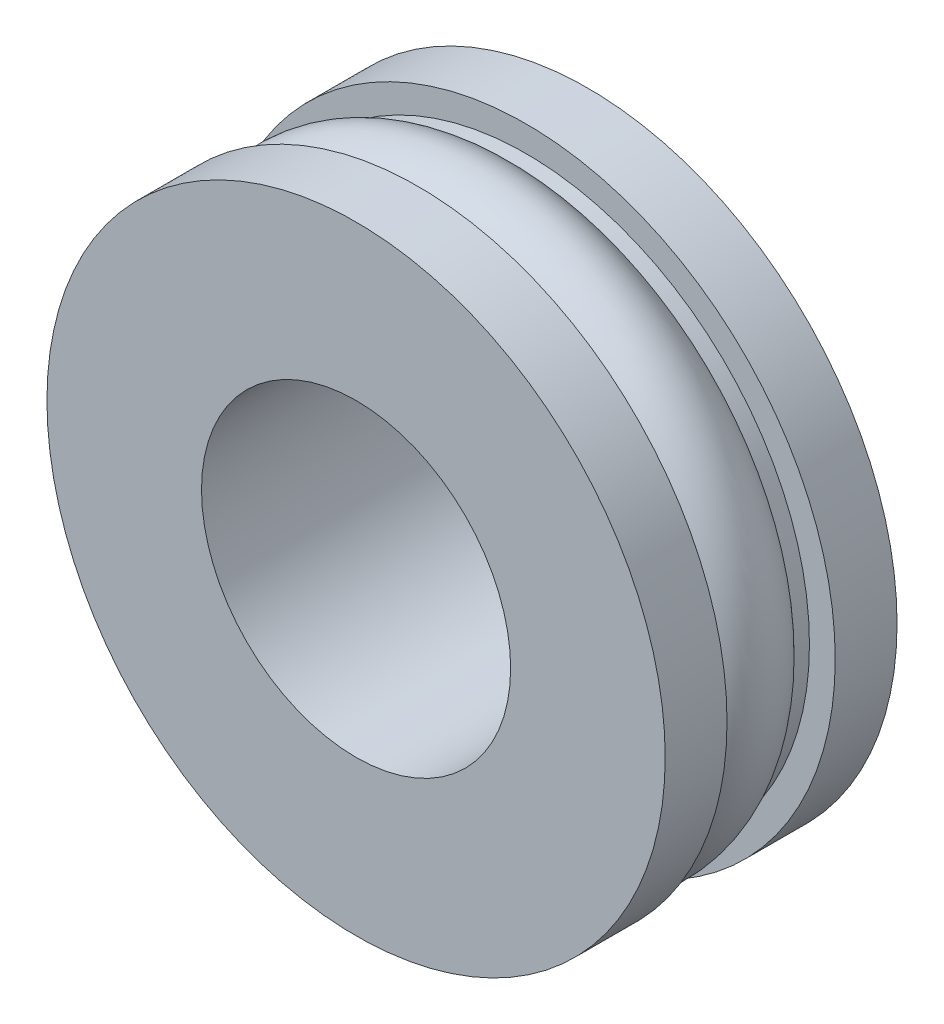
ISO-10303-21;
HEADER;
FILE_DESCRIPTION(('STEP AP214'),'2;1');
FILE_NAME('part.step','',(''),(''),'','','');
FILE_SCHEMA(('AUTOMOTIVE_DESIGN { 1 0 10303 214 1 1 1 1 }'));
ENDSEC;
DATA;
#1=APPLICATION_CONTEXT('core data for automotive mechanical design processes');
#2=APPLICATION_PROTOCOL_DEFINITION('international standard','automotive_design',2000,#1);
#3=PRODUCT_CONTEXT('',#1,'mechanical');
#4=PRODUCT('Part','Part','',(#3));
#5=PRODUCT_RELATED_PRODUCT_CATEGORY('part','',(#4));
#6=PRODUCT_DEFINITION_FORMATION('','',#4);
#7=PRODUCT_DEFINITION_CONTEXT('part definition',#1,'design');
#8=PRODUCT_DEFINITION('design','',#6,#7);
#9=PRODUCT_DEFINITION_SHAPE('','',#8);
#10=(LENGTH_UNIT() NAMED_UNIT(*) SI_UNIT(.MILLI.,.METRE.));
#11=(NAMED_UNIT(*) PLANE_ANGLE_UNIT() SI_UNIT($,.RADIAN.));
#12=(NAMED_UNIT(*) SI_UNIT($,.STERADIAN.) SOLID_ANGLE_UNIT());
#13=UNCERTAINTY_MEASURE_WITH_UNIT(LENGTH_MEASURE(1.E-05),#10,'distance_accuracy_value','');
#14=(GEOMETRIC_REPRESENTATION_CONTEXT(3) GLOBAL_UNCERTAINTY_ASSIGNED_CONTEXT((#13)) GLOBAL_UNIT_ASSIGNED_CONTEXT((#10,
#11,#12)) REPRESENTATION_CONTEXT('',''));
#15=CARTESIAN_POINT('',(0.,0.,0.));
#16=DIRECTION('',(0.,0.,1.));
#17=DIRECTION('',(1.,0.,0.));
#18=AXIS2_PLACEMENT_3D('',#15,#16,#17);
#19=CARTESIAN_POINT('',(0.,0.,0.));
#20=DIRECTION('',(0.,0.,1.));
#21=DIRECTION('',(1.,0.,0.));
#22=AXIS2_PLACEMENT_3D('',#19,#20,#21);
#23=PLANE('',#22);
#24=CARTESIAN_POINT('',(0.,0.,0.));
#25=DIRECTION('',(0.,0.,-1.));
#26=DIRECTION('',(1.,0.,0.));
#27=AXIS2_PLACEMENT_3D('',#24,#25,#26);
#28=CIRCLE('',#27,3.);
#29=CARTESIAN_POINT('',(-3.,0.,0.));
#30=VERTEX_POINT('',#29);
#31=EDGE_CURVE('E58',#30,#30,#28,.T.);
#32=ORIENTED_EDGE('',*,*,#31,.F.);
#33=EDGE_LOOP('',(#32));
#34=FACE_BOUND('',#33,.T.);
#35=CARTESIAN_POINT('',(0.,0.,0.));
#36=DIRECTION('',(0.,0.,1.));
#37=DIRECTION('',(1.,0.,0.));
#38=AXIS2_PLACEMENT_3D('',#35,#36,#37);
#39=CIRCLE('',#38,6.);
#40=CARTESIAN_POINT('',(-6.,0.,0.));
#41=VERTEX_POINT('',#40);
#42=EDGE_CURVE('E68',#41,#41,#39,.T.);
#43=ORIENTED_EDGE('',*,*,#42,.F.);
#44=EDGE_LOOP('',(#43));
#45=FACE_BOUND('',#44,.T.);
#46=ADVANCED_FACE('F17',(#34,#45),#23,.F.);
#47=CARTESIAN_POINT('',(0.,0.,4.5));
#48=DIRECTION('',(0.,0.,1.));
#49=DIRECTION('',(1.,0.,0.));
#50=AXIS2_PLACEMENT_3D('',#47,#48,#49);
#51=PLANE('',#50);
#52=CARTESIAN_POINT('',(0.,0.,4.5));
#53=DIRECTION('',(0.,0.,-1.));
#54=DIRECTION('',(1.,0.,0.));
#55=AXIS2_PLACEMENT_3D('',#52,#53,#54);
#56=CIRCLE('',#55,3.);
#57=CARTESIAN_POINT('',(-3.,0.,4.5));
#58=VERTEX_POINT('',#57);
#59=EDGE_CURVE('E59',#58,#58,#56,.T.);
#60=ORIENTED_EDGE('',*,*,#59,.T.);
#61=EDGE_LOOP('',(#60));
#62=FACE_BOUND('',#61,.T.);
#63=CARTESIAN_POINT('',(0.,0.,4.5));
#64=DIRECTION('',(0.,0.,1.));
#65=DIRECTION('',(1.,0.,0.));
#66=AXIS2_PLACEMENT_3D('',#63,#64,#65);
#67=CIRCLE('',#66,6.);
#68=CARTESIAN_POINT('',(-6.,0.,4.5));
#69=VERTEX_POINT('',#68);
#70=EDGE_CURVE('E26',#69,#69,#67,.T.);
#71=ORIENTED_EDGE('',*,*,#70,.T.);
#72=EDGE_LOOP('',(#71));
#73=FACE_BOUND('',#72,.T.);
#74=ADVANCED_FACE('F83',(#62,#73),#51,.T.);
#75=CARTESIAN_POINT('',(0.,0.,0.));
#76=DIRECTION('',(0.,0.,1.));
#77=DIRECTION('',(1.,0.,0.));
#78=AXIS2_PLACEMENT_3D('',#75,#76,#77);
#79=CYLINDRICAL_SURFACE('',#78,6.);
#80=ORIENTED_EDGE('',*,*,#70,.F.);
#81=DIRECTION('',(0.,0.,-1.));
#82=VECTOR('',#81,1.);
#83=CARTESIAN_POINT('',(-6.,0.,0.));
#84=LINE('',#83,#82);
#85=CARTESIAN_POINT('',(-6.,0.,3.3));
#86=VERTEX_POINT('',#85);
#87=EDGE_CURVE('E11',#69,#86,#84,.T.);
#88=ORIENTED_EDGE('',*,*,#87,.T.);
#89=CARTESIAN_POINT('',(0.,0.,3.3));
#90=DIRECTION('',(0.,0.,1.));
#91=DIRECTION('',(1.,0.,0.));
#92=AXIS2_PLACEMENT_3D('',#89,#90,#91);
#93=CIRCLE('',#92,6.);
#94=EDGE_CURVE('E72',#86,#86,#93,.T.);
#95=ORIENTED_EDGE('',*,*,#94,.T.);
#96=ORIENTED_EDGE('',*,*,#87,.F.);
#97=EDGE_LOOP('',(#80,#88,#95,#96));
#98=FACE_BOUND('',#97,.T.);
#99=ADVANCED_FACE('F84',(#98),#79,.T.);
#100=CARTESIAN_POINT('',(0.,0.,0.));
#101=DIRECTION('',(0.,0.,1.));
#102=DIRECTION('',(1.,0.,0.));
#103=AXIS2_PLACEMENT_3D('',#100,#101,#102);
#104=CYLINDRICAL_SURFACE('',#103,3.);
#105=ORIENTED_EDGE('',*,*,#31,.T.);
#106=DIRECTION('',(0.,0.,1.));
#107=VECTOR('',#106,1.);
#108=CARTESIAN_POINT('',(-3.,0.,0.));
#109=LINE('',#108,#107);
#110=EDGE_CURVE('E55',#30,#58,#109,.T.);
#111=ORIENTED_EDGE('',*,*,#110,.T.);
#112=ORIENTED_EDGE('',*,*,#59,.F.);
#113=ORIENTED_EDGE('',*,*,#110,.F.);
#114=EDGE_LOOP('',(#105,#111,#112,#113));
#115=FACE_BOUND('',#114,.T.);
#116=ADVANCED_FACE('F56',(#115),#104,.F.);
#117=CARTESIAN_POINT('',(0.,0.,0.));
#118=DIRECTION('',(0.,0.,1.));
#119=DIRECTION('',(1.,0.,0.));
#120=AXIS2_PLACEMENT_3D('',#117,#118,#119);
#121=CYLINDRICAL_SURFACE('',#120,6.);
#122=CARTESIAN_POINT('',(0.,0.,1.2));
#123=DIRECTION('',(0.,0.,-1.));
#124=DIRECTION('',(1.,0.,0.));
#125=AXIS2_PLACEMENT_3D('',#122,#123,#124);
#126=CIRCLE('',#125,6.);
#127=CARTESIAN_POINT('',(-6.,0.,1.2));
#128=VERTEX_POINT('',#127);
#129=EDGE_CURVE('E151',#128,#128,#126,.T.);
#130=ORIENTED_EDGE('',*,*,#129,.T.);
#131=DIRECTION('',(0.,0.,-1.));
#132=VECTOR('',#131,1.);
#133=CARTESIAN_POINT('',(-6.,0.,0.));
#134=LINE('',#133,#132);
#135=EDGE_CURVE('E74',#128,#41,#134,.T.);
#136=ORIENTED_EDGE('',*,*,#135,.T.);
#137=ORIENTED_EDGE('',*,*,#42,.T.);
#138=ORIENTED_EDGE('',*,*,#135,.F.);
#139=EDGE_LOOP('',(#130,#136,#137,#138));
#140=FACE_BOUND('',#139,.T.);
#141=ADVANCED_FACE('F165',(#140),#121,.T.);
#142=CARTESIAN_POINT('',(0.,0.,3.3));
#143=DIRECTION('',(0.,0.,1.));
#144=DIRECTION('',(1.,0.,0.));
#145=AXIS2_PLACEMENT_3D('',#142,#143,#144);
#146=PLANE('',#145);
#147=CARTESIAN_POINT('',(0.,0.,3.3));
#148=DIRECTION('',(0.,0.,-1.));
#149=DIRECTION('',(1.,0.,0.));
#150=AXIS2_PLACEMENT_3D('',#147,#148,#149);
#151=CIRCLE('',#150,5.5);
#152=CARTESIAN_POINT('',(-5.5,0.,3.3));
#153=VERTEX_POINT('',#152);
#154=EDGE_CURVE('E150',#153,#153,#151,.T.);
#155=ORIENTED_EDGE('',*,*,#154,.F.);
#156=EDGE_LOOP('',(#155));
#157=FACE_BOUND('',#156,.T.);
#158=ORIENTED_EDGE('',*,*,#94,.F.);
#159=EDGE_LOOP('',(#158));
#160=FACE_BOUND('',#159,.T.);
#161=ADVANCED_FACE('F179',(#157,#160),#146,.F.);
#162=CARTESIAN_POINT('',(0.,0.,3.3));
#163=DIRECTION('',(0.,0.,-1.));
#164=DIRECTION('',(1.,0.,0.));
#165=AXIS2_PLACEMENT_3D('',#162,#163,#164);
#166=CYLINDRICAL_SURFACE('',#165,5.5);
#167=CARTESIAN_POINT('',(0.,0.,3.));
#168=DIRECTION('',(0.,0.,1.));
#169=DIRECTION('',(1.,0.,0.));
#170=AXIS2_PLACEMENT_3D('',#167,#168,#169);
#171=CIRCLE('',#170,5.5);
#172=CARTESIAN_POINT('',(-5.5,0.,3.));
#173=VERTEX_POINT('',#172);
#174=CARTESIAN_POINT('',(5.5,0.,3.));
#175=VERTEX_POINT('',#174);
#176=EDGE_CURVE('E142',#173,#175,#171,.T.);
#177=ORIENTED_EDGE('',*,*,#176,.T.);
#178=CARTESIAN_POINT('',(0.,0.,3.));
#179=DIRECTION('',(0.,0.,1.));
#180=DIRECTION('',(1.,0.,0.));
#181=AXIS2_PLACEMENT_3D('',#178,#179,#180);
#182=CIRCLE('',#181,5.5);
#183=EDGE_CURVE('E125',#175,#173,#182,.T.);
#184=ORIENTED_EDGE('',*,*,#183,.T.);
#185=DIRECTION('',(0.,0.,1.));
#186=VECTOR('',#185,1.);
#187=CARTESIAN_POINT('',(-5.5,0.,3.3));
#188=LINE('',#187,#186);
#189=EDGE_CURVE('E146',#173,#153,#188,.T.);
#190=ORIENTED_EDGE('',*,*,#189,.T.);
#191=ORIENTED_EDGE('',*,*,#154,.T.);
#192=ORIENTED_EDGE('',*,*,#189,.F.);
#193=EDGE_LOOP('',(#177,#184,#190,#191,#192));
#194=FACE_BOUND('',#193,.T.);
#195=ADVANCED_FACE('F169',(#194),#166,.T.);
#196=CARTESIAN_POINT('',(0.,0.,1.2));
#197=DIRECTION('',(0.,0.,-1.));
#198=DIRECTION('',(0.,-1.,0.));
#199=AXIS2_PLACEMENT_3D('',#196,#197,#198);
#200=PLANE('',#199);
#201=CARTESIAN_POINT('',(0.,0.,1.2));
#202=DIRECTION('',(0.,0.,1.));
#203=DIRECTION('',(1.,0.,0.));
#204=AXIS2_PLACEMENT_3D('',#201,#202,#203);
#205=CIRCLE('',#204,5.5);
#206=CARTESIAN_POINT('',(-5.5,0.,1.2));
#207=VERTEX_POINT('',#206);
#208=EDGE_CURVE('E123',#207,#207,#205,.T.);
#209=ORIENTED_EDGE('',*,*,#208,.F.);
#210=EDGE_LOOP('',(#209));
#211=FACE_BOUND('',#210,.T.);
#212=ORIENTED_EDGE('',*,*,#129,.F.);
#213=EDGE_LOOP('',(#212));
#214=FACE_BOUND('',#213,.T.);
#215=ADVANCED_FACE('F167',(#211,#214),#200,.F.);
#216=CARTESIAN_POINT('',(0.,0.,1.2));
#217=DIRECTION('',(0.,0.,1.));
#218=DIRECTION('',(1.,0.,0.));
#219=AXIS2_PLACEMENT_3D('',#216,#217,#218);
#220=CYLINDRICAL_SURFACE('',#219,5.5);
#221=CARTESIAN_POINT('',(0.,0.,1.5));
#222=DIRECTION('',(0.,0.,-1.));
#223=DIRECTION('',(1.,0.,0.));
#224=AXIS2_PLACEMENT_3D('',#221,#222,#223);
#225=CIRCLE('',#224,5.5);
#226=CARTESIAN_POINT('',(-5.5,0.,1.5));
#227=VERTEX_POINT('',#226);
#228=CARTESIAN_POINT('',(5.5,0.,1.5));
#229=VERTEX_POINT('',#228);
#230=EDGE_CURVE('E121',#227,#229,#225,.T.);
#231=ORIENTED_EDGE('',*,*,#230,.T.);
#232=CARTESIAN_POINT('',(0.,0.,1.5));
#233=DIRECTION('',(0.,0.,-1.));
#234=DIRECTION('',(1.,0.,0.));
#235=AXIS2_PLACEMENT_3D('',#232,#233,#234);
#236=CIRCLE('',#235,5.5);
#237=EDGE_CURVE('E128',#229,#227,#236,.T.);
#238=ORIENTED_EDGE('',*,*,#237,.T.);
#239=DIRECTION('',(0.,0.,-1.));
#240=VECTOR('',#239,1.);
#241=CARTESIAN_POINT('',(-5.5,0.,1.2));
#242=LINE('',#241,#240);
#243=EDGE_CURVE('E117',#227,#207,#242,.T.);
#244=ORIENTED_EDGE('',*,*,#243,.T.);
#245=ORIENTED_EDGE('',*,*,#208,.T.);
#246=ORIENTED_EDGE('',*,*,#243,.F.);
#247=EDGE_LOOP('',(#231,#238,#244,#245,#246));
#248=FACE_BOUND('',#247,.T.);
#249=ADVANCED_FACE('F119',(#248),#220,.T.);
#250=CARTESIAN_POINT('',(0.,0.,2.25));
#251=DIRECTION('',(0.,0.,-1.));
#252=DIRECTION('',(-1.,0.,0.));
#253=AXIS2_PLACEMENT_3D('',#250,#251,#252);
#254=TOROIDAL_SURFACE('',#253,4.83856217223385,1.);
#255=ORIENTED_EDGE('',*,*,#230,.F.);
#256=ORIENTED_EDGE('',*,*,#237,.F.);
#257=CARTESIAN_POINT('',(4.83856217223385,0.,2.25));
#258=DIRECTION('',(0.,-1.,0.));
#259=DIRECTION('',(1.,0.,0.));
#260=AXIS2_PLACEMENT_3D('',#257,#258,#259);
#261=CIRCLE('',#260,1.);
#262=EDGE_CURVE('E132',#229,#175,#261,.T.);
#263=ORIENTED_EDGE('',*,*,#262,.T.);
#264=ORIENTED_EDGE('',*,*,#176,.F.);
#265=ORIENTED_EDGE('',*,*,#183,.F.);
#266=ORIENTED_EDGE('',*,*,#262,.F.);
#267=EDGE_LOOP('',(#255,#256,#263,#264,#265,#266));
#268=FACE_BOUND('',#267,.T.);
#269=ADVANCED_FACE('F134',(#268),#254,.T.);
#270=CLOSED_SHELL('',(#46,#74,#99,#116,#141,#161,#195,#215,#249,#269));
#271=MANIFOLD_SOLID_BREP('B1',#270);
#272=ADVANCED_BREP_SHAPE_REPRESENTATION('',(#18,#271),#14);
#273=SHAPE_DEFINITION_REPRESENTATION(#9,#272);
ENDSEC;
END-ISO-10303-21;
